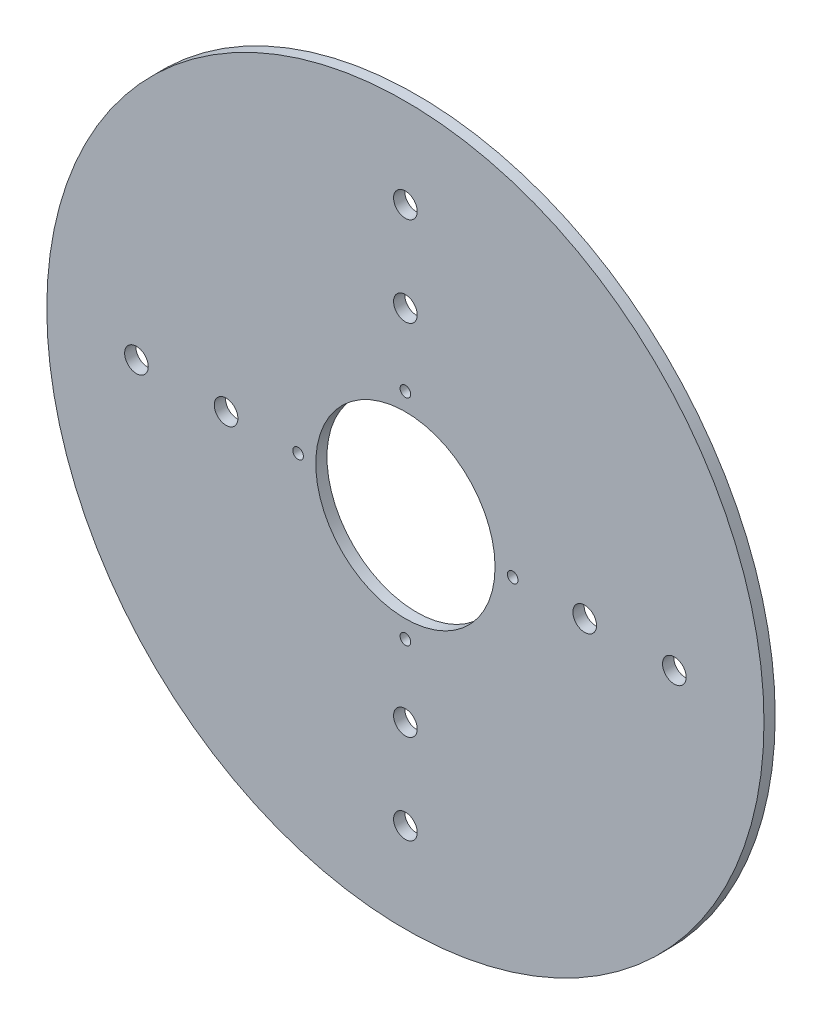
ISO-10303-21;
HEADER;
FILE_DESCRIPTION(('STEP AP214'),'2;1');
FILE_NAME('part.step','',(''),(''),'','','');
FILE_SCHEMA(('AUTOMOTIVE_DESIGN { 1 0 10303 214 1 1 1 1 }'));
ENDSEC;
DATA;
#1=APPLICATION_CONTEXT('core data for automotive mechanical design processes');
#2=APPLICATION_PROTOCOL_DEFINITION('international standard','automotive_design',2000,#1);
#3=PRODUCT_CONTEXT('',#1,'mechanical');
#4=PRODUCT('Part','Part','',(#3));
#5=PRODUCT_RELATED_PRODUCT_CATEGORY('part','',(#4));
#6=PRODUCT_DEFINITION_FORMATION('','',#4);
#7=PRODUCT_DEFINITION_CONTEXT('part definition',#1,'design');
#8=PRODUCT_DEFINITION('design','',#6,#7);
#9=PRODUCT_DEFINITION_SHAPE('','',#8);
#10=(LENGTH_UNIT() NAMED_UNIT(*) SI_UNIT(.MILLI.,.METRE.));
#11=(NAMED_UNIT(*) PLANE_ANGLE_UNIT() SI_UNIT($,.RADIAN.));
#12=(NAMED_UNIT(*) SI_UNIT($,.STERADIAN.) SOLID_ANGLE_UNIT());
#13=UNCERTAINTY_MEASURE_WITH_UNIT(LENGTH_MEASURE(1.E-05),#10,'distance_accuracy_value','');
#14=(GEOMETRIC_REPRESENTATION_CONTEXT(3) GLOBAL_UNCERTAINTY_ASSIGNED_CONTEXT((#13)) GLOBAL_UNIT_ASSIGNED_CONTEXT((#10,
#11,#12)) REPRESENTATION_CONTEXT('',''));
#15=CARTESIAN_POINT('',(0.,0.,0.));
#16=DIRECTION('',(0.,0.,1.));
#17=DIRECTION('',(1.,0.,0.));
#18=AXIS2_PLACEMENT_3D('',#15,#16,#17);
#19=CARTESIAN_POINT('',(0.,0.,3.175));
#20=DIRECTION('',(0.,0.,-1.));
#21=DIRECTION('',(-1.,0.,0.));
#22=AXIS2_PLACEMENT_3D('',#19,#20,#21);
#23=CYLINDRICAL_SURFACE('',#22,101.6);
#24=CARTESIAN_POINT('',(0.,0.,3.175));
#25=DIRECTION('',(0.,0.,1.));
#26=DIRECTION('',(1.,0.,0.));
#27=AXIS2_PLACEMENT_3D('',#24,#25,#26);
#28=CIRCLE('',#27,101.6);
#29=CARTESIAN_POINT('',(101.6,0.,3.175));
#30=VERTEX_POINT('',#29);
#31=EDGE_CURVE('E10',#30,#30,#28,.T.);
#32=ORIENTED_EDGE('',*,*,#31,.F.);
#33=EDGE_LOOP('',(#32));
#34=FACE_BOUND('',#33,.T.);
#35=CARTESIAN_POINT('',(0.,0.,0.));
#36=DIRECTION('',(0.,0.,1.));
#37=DIRECTION('',(1.,0.,0.));
#38=AXIS2_PLACEMENT_3D('',#35,#36,#37);
#39=CIRCLE('',#38,101.6);
#40=CARTESIAN_POINT('',(101.6,0.,0.));
#41=VERTEX_POINT('',#40);
#42=EDGE_CURVE('E34',#41,#41,#39,.T.);
#43=ORIENTED_EDGE('',*,*,#42,.T.);
#44=EDGE_LOOP('',(#43));
#45=FACE_BOUND('',#44,.T.);
#46=ADVANCED_FACE('F31',(#34,#45),#23,.T.);
#47=CARTESIAN_POINT('',(0.,0.,3.175));
#48=DIRECTION('',(0.,0.,1.));
#49=DIRECTION('',(1.,0.,0.));
#50=AXIS2_PLACEMENT_3D('',#47,#48,#49);
#51=PLANE('',#50);
#52=CARTESIAN_POINT('',(76.2,0.,3.175));
#53=DIRECTION('',(0.,0.,1.));
#54=DIRECTION('',(1.,0.,0.));
#55=AXIS2_PLACEMENT_3D('',#52,#53,#54);
#56=CIRCLE('',#55,3.35);
#57=CARTESIAN_POINT('',(79.55,0.,3.175));
#58=VERTEX_POINT('',#57);
#59=EDGE_CURVE('E89',#58,#58,#56,.T.);
#60=ORIENTED_EDGE('',*,*,#59,.F.);
#61=EDGE_LOOP('',(#60));
#62=FACE_BOUND('',#61,.T.);
#63=CARTESIAN_POINT('',(0.,76.2,3.175));
#64=DIRECTION('',(0.,0.,1.));
#65=DIRECTION('',(1.,0.,0.));
#66=AXIS2_PLACEMENT_3D('',#63,#64,#65);
#67=CIRCLE('',#66,3.35);
#68=CARTESIAN_POINT('',(3.35,76.2,3.175));
#69=VERTEX_POINT('',#68);
#70=EDGE_CURVE('E99',#69,#69,#67,.T.);
#71=ORIENTED_EDGE('',*,*,#70,.F.);
#72=EDGE_LOOP('',(#71));
#73=FACE_BOUND('',#72,.T.);
#74=CARTESIAN_POINT('',(-76.2,0.,3.175));
#75=DIRECTION('',(0.,0.,1.));
#76=DIRECTION('',(1.,0.,0.));
#77=AXIS2_PLACEMENT_3D('',#74,#75,#76);
#78=CIRCLE('',#77,3.35);
#79=CARTESIAN_POINT('',(-72.85,0.,3.175));
#80=VERTEX_POINT('',#79);
#81=EDGE_CURVE('E102',#80,#80,#78,.T.);
#82=ORIENTED_EDGE('',*,*,#81,.F.);
#83=EDGE_LOOP('',(#82));
#84=FACE_BOUND('',#83,.T.);
#85=CARTESIAN_POINT('',(0.,-76.2,3.175));
#86=DIRECTION('',(0.,0.,1.));
#87=DIRECTION('',(1.,0.,0.));
#88=AXIS2_PLACEMENT_3D('',#85,#86,#87);
#89=CIRCLE('',#88,3.35);
#90=CARTESIAN_POINT('',(3.35,-76.2,3.175));
#91=VERTEX_POINT('',#90);
#92=EDGE_CURVE('E105',#91,#91,#89,.T.);
#93=ORIENTED_EDGE('',*,*,#92,.F.);
#94=EDGE_LOOP('',(#93));
#95=FACE_BOUND('',#94,.T.);
#96=CARTESIAN_POINT('',(0.,50.8,3.175));
#97=DIRECTION('',(0.,0.,1.));
#98=DIRECTION('',(1.,0.,0.));
#99=AXIS2_PLACEMENT_3D('',#96,#97,#98);
#100=CIRCLE('',#99,3.35);
#101=CARTESIAN_POINT('',(3.35,50.8,3.175));
#102=VERTEX_POINT('',#101);
#103=EDGE_CURVE('E65',#102,#102,#100,.T.);
#104=ORIENTED_EDGE('',*,*,#103,.F.);
#105=EDGE_LOOP('',(#104));
#106=FACE_BOUND('',#105,.T.);
#107=CARTESIAN_POINT('',(50.8,0.,3.175));
#108=DIRECTION('',(0.,0.,1.));
#109=DIRECTION('',(1.,0.,0.));
#110=AXIS2_PLACEMENT_3D('',#107,#108,#109);
#111=CIRCLE('',#110,3.35);
#112=CARTESIAN_POINT('',(54.15,0.,3.175));
#113=VERTEX_POINT('',#112);
#114=EDGE_CURVE('E75',#113,#113,#111,.T.);
#115=ORIENTED_EDGE('',*,*,#114,.F.);
#116=EDGE_LOOP('',(#115));
#117=FACE_BOUND('',#116,.T.);
#118=CARTESIAN_POINT('',(0.,-50.8,3.175));
#119=DIRECTION('',(0.,0.,1.));
#120=DIRECTION('',(1.,0.,0.));
#121=AXIS2_PLACEMENT_3D('',#118,#119,#120);
#122=CIRCLE('',#121,3.35);
#123=CARTESIAN_POINT('',(3.35,-50.8,3.175));
#124=VERTEX_POINT('',#123);
#125=EDGE_CURVE('E78',#124,#124,#122,.T.);
#126=ORIENTED_EDGE('',*,*,#125,.F.);
#127=EDGE_LOOP('',(#126));
#128=FACE_BOUND('',#127,.T.);
#129=CARTESIAN_POINT('',(-50.8,0.,3.175));
#130=DIRECTION('',(0.,0.,1.));
#131=DIRECTION('',(1.,0.,0.));
#132=AXIS2_PLACEMENT_3D('',#129,#130,#131);
#133=CIRCLE('',#132,3.35);
#134=CARTESIAN_POINT('',(-47.45,0.,3.175));
#135=VERTEX_POINT('',#134);
#136=EDGE_CURVE('E81',#135,#135,#133,.T.);
#137=ORIENTED_EDGE('',*,*,#136,.F.);
#138=EDGE_LOOP('',(#137));
#139=FACE_BOUND('',#138,.T.);
#140=CARTESIAN_POINT('',(0.,30.399999906,3.175));
#141=DIRECTION('',(0.,0.,1.));
#142=DIRECTION('',(1.,0.,0.));
#143=AXIS2_PLACEMENT_3D('',#140,#141,#142);
#144=CIRCLE('',#143,1.5);
#145=CARTESIAN_POINT('',(1.5,30.399999906,3.175));
#146=VERTEX_POINT('',#145);
#147=EDGE_CURVE('E46',#146,#146,#144,.T.);
#148=ORIENTED_EDGE('',*,*,#147,.F.);
#149=EDGE_LOOP('',(#148));
#150=FACE_BOUND('',#149,.T.);
#151=CARTESIAN_POINT('',(-30.399999906,0.,3.175));
#152=DIRECTION('',(0.,0.,1.));
#153=DIRECTION('',(1.,0.,0.));
#154=AXIS2_PLACEMENT_3D('',#151,#152,#153);
#155=CIRCLE('',#154,1.5);
#156=CARTESIAN_POINT('',(-28.899999906,0.,3.175));
#157=VERTEX_POINT('',#156);
#158=EDGE_CURVE('E51',#157,#157,#155,.T.);
#159=ORIENTED_EDGE('',*,*,#158,.F.);
#160=EDGE_LOOP('',(#159));
#161=FACE_BOUND('',#160,.T.);
#162=CARTESIAN_POINT('',(0.,-30.399999906,3.175));
#163=DIRECTION('',(0.,0.,1.));
#164=DIRECTION('',(1.,0.,0.));
#165=AXIS2_PLACEMENT_3D('',#162,#163,#164);
#166=CIRCLE('',#165,1.5);
#167=CARTESIAN_POINT('',(1.5,-30.399999906,3.175));
#168=VERTEX_POINT('',#167);
#169=EDGE_CURVE('E54',#168,#168,#166,.T.);
#170=ORIENTED_EDGE('',*,*,#169,.F.);
#171=EDGE_LOOP('',(#170));
#172=FACE_BOUND('',#171,.T.);
#173=CARTESIAN_POINT('',(30.399999906,0.,3.175));
#174=DIRECTION('',(0.,0.,1.));
#175=DIRECTION('',(1.,0.,0.));
#176=AXIS2_PLACEMENT_3D('',#173,#174,#175);
#177=CIRCLE('',#176,1.5);
#178=CARTESIAN_POINT('',(31.899999906,0.,3.175));
#179=VERTEX_POINT('',#178);
#180=EDGE_CURVE('E57',#179,#179,#177,.T.);
#181=ORIENTED_EDGE('',*,*,#180,.F.);
#182=EDGE_LOOP('',(#181));
#183=FACE_BOUND('',#182,.T.);
#184=CARTESIAN_POINT('',(0.,0.,3.175));
#185=DIRECTION('',(0.,0.,1.));
#186=DIRECTION('',(1.,0.,0.));
#187=AXIS2_PLACEMENT_3D('',#184,#185,#186);
#188=CIRCLE('',#187,25.4);
#189=CARTESIAN_POINT('',(25.4,0.,3.175));
#190=VERTEX_POINT('',#189);
#191=EDGE_CURVE('E43',#190,#190,#188,.T.);
#192=ORIENTED_EDGE('',*,*,#191,.F.);
#193=EDGE_LOOP('',(#192));
#194=FACE_BOUND('',#193,.T.);
#195=ORIENTED_EDGE('',*,*,#31,.T.);
#196=EDGE_LOOP('',(#195));
#197=FACE_BOUND('',#196,.T.);
#198=ADVANCED_FACE('F127',(#62,#73,#84,#95,#106,#117,#128,#139,#150,#161,#172,#183,#194,#197),
#51,.T.);
#199=CARTESIAN_POINT('',(0.,0.,0.));
#200=DIRECTION('',(0.,0.,1.));
#201=DIRECTION('',(1.,0.,0.));
#202=AXIS2_PLACEMENT_3D('',#199,#200,#201);
#203=PLANE('',#202);
#204=CARTESIAN_POINT('',(76.2,0.,0.));
#205=DIRECTION('',(0.,0.,-1.));
#206=DIRECTION('',(-1.,0.,0.));
#207=AXIS2_PLACEMENT_3D('',#204,#205,#206);
#208=CIRCLE('',#207,3.35);
#209=CARTESIAN_POINT('',(72.85,0.,0.));
#210=VERTEX_POINT('',#209);
#211=EDGE_CURVE('E108',#210,#210,#208,.T.);
#212=ORIENTED_EDGE('',*,*,#211,.F.);
#213=EDGE_LOOP('',(#212));
#214=FACE_BOUND('',#213,.T.);
#215=CARTESIAN_POINT('',(0.,76.2,0.));
#216=DIRECTION('',(0.,0.,-1.));
#217=DIRECTION('',(-1.,0.,0.));
#218=AXIS2_PLACEMENT_3D('',#215,#216,#217);
#219=CIRCLE('',#218,3.35);
#220=CARTESIAN_POINT('',(-3.35,76.2,0.));
#221=VERTEX_POINT('',#220);
#222=EDGE_CURVE('E115',#221,#221,#219,.T.);
#223=ORIENTED_EDGE('',*,*,#222,.F.);
#224=EDGE_LOOP('',(#223));
#225=FACE_BOUND('',#224,.T.);
#226=CARTESIAN_POINT('',(-76.2,0.,0.));
#227=DIRECTION('',(0.,0.,-1.));
#228=DIRECTION('',(-1.,0.,0.));
#229=AXIS2_PLACEMENT_3D('',#226,#227,#228);
#230=CIRCLE('',#229,3.35);
#231=CARTESIAN_POINT('',(-79.55,0.,0.));
#232=VERTEX_POINT('',#231);
#233=EDGE_CURVE('E112',#232,#232,#230,.T.);
#234=ORIENTED_EDGE('',*,*,#233,.F.);
#235=EDGE_LOOP('',(#234));
#236=FACE_BOUND('',#235,.T.);
#237=CARTESIAN_POINT('',(0.,-76.2,0.));
#238=DIRECTION('',(0.,0.,-1.));
#239=DIRECTION('',(-1.,0.,0.));
#240=AXIS2_PLACEMENT_3D('',#237,#238,#239);
#241=CIRCLE('',#240,3.35);
#242=CARTESIAN_POINT('',(-3.35,-76.2,0.));
#243=VERTEX_POINT('',#242);
#244=EDGE_CURVE('E109',#243,#243,#241,.T.);
#245=ORIENTED_EDGE('',*,*,#244,.F.);
#246=EDGE_LOOP('',(#245));
#247=FACE_BOUND('',#246,.T.);
#248=CARTESIAN_POINT('',(0.,50.8,0.));
#249=DIRECTION('',(0.,0.,-1.));
#250=DIRECTION('',(-1.,0.,0.));
#251=AXIS2_PLACEMENT_3D('',#248,#249,#250);
#252=CIRCLE('',#251,3.35);
#253=CARTESIAN_POINT('',(-3.35,50.8,0.));
#254=VERTEX_POINT('',#253);
#255=EDGE_CURVE('E84',#254,#254,#252,.T.);
#256=ORIENTED_EDGE('',*,*,#255,.F.);
#257=EDGE_LOOP('',(#256));
#258=FACE_BOUND('',#257,.T.);
#259=CARTESIAN_POINT('',(50.8,0.,0.));
#260=DIRECTION('',(0.,0.,-1.));
#261=DIRECTION('',(-1.,0.,0.));
#262=AXIS2_PLACEMENT_3D('',#259,#260,#261);
#263=CIRCLE('',#262,3.35);
#264=CARTESIAN_POINT('',(47.45,0.,0.));
#265=VERTEX_POINT('',#264);
#266=EDGE_CURVE('E92',#265,#265,#263,.T.);
#267=ORIENTED_EDGE('',*,*,#266,.F.);
#268=EDGE_LOOP('',(#267));
#269=FACE_BOUND('',#268,.T.);
#270=CARTESIAN_POINT('',(0.,-50.8,0.));
#271=DIRECTION('',(0.,0.,-1.));
#272=DIRECTION('',(-1.,0.,0.));
#273=AXIS2_PLACEMENT_3D('',#270,#271,#272);
#274=CIRCLE('',#273,3.35);
#275=CARTESIAN_POINT('',(-3.35,-50.8,0.));
#276=VERTEX_POINT('',#275);
#277=EDGE_CURVE('E88',#276,#276,#274,.T.);
#278=ORIENTED_EDGE('',*,*,#277,.F.);
#279=EDGE_LOOP('',(#278));
#280=FACE_BOUND('',#279,.T.);
#281=CARTESIAN_POINT('',(-50.8,0.,0.));
#282=DIRECTION('',(0.,0.,-1.));
#283=DIRECTION('',(-1.,0.,0.));
#284=AXIS2_PLACEMENT_3D('',#281,#282,#283);
#285=CIRCLE('',#284,3.35);
#286=CARTESIAN_POINT('',(-54.15,0.,0.));
#287=VERTEX_POINT('',#286);
#288=EDGE_CURVE('E85',#287,#287,#285,.T.);
#289=ORIENTED_EDGE('',*,*,#288,.F.);
#290=EDGE_LOOP('',(#289));
#291=FACE_BOUND('',#290,.T.);
#292=CARTESIAN_POINT('',(0.,30.399999906,0.));
#293=DIRECTION('',(0.,0.,-1.));
#294=DIRECTION('',(-1.,0.,0.));
#295=AXIS2_PLACEMENT_3D('',#292,#293,#294);
#296=CIRCLE('',#295,1.5);
#297=CARTESIAN_POINT('',(-1.5,30.399999906,0.));
#298=VERTEX_POINT('',#297);
#299=EDGE_CURVE('E60',#298,#298,#296,.T.);
#300=ORIENTED_EDGE('',*,*,#299,.F.);
#301=EDGE_LOOP('',(#300));
#302=FACE_BOUND('',#301,.T.);
#303=CARTESIAN_POINT('',(-30.399999906,0.,0.));
#304=DIRECTION('',(0.,0.,-1.));
#305=DIRECTION('',(-1.,0.,0.));
#306=AXIS2_PLACEMENT_3D('',#303,#304,#305);
#307=CIRCLE('',#306,1.5);
#308=CARTESIAN_POINT('',(-31.899999906,0.,0.));
#309=VERTEX_POINT('',#308);
#310=EDGE_CURVE('E68',#309,#309,#307,.T.);
#311=ORIENTED_EDGE('',*,*,#310,.F.);
#312=EDGE_LOOP('',(#311));
#313=FACE_BOUND('',#312,.T.);
#314=CARTESIAN_POINT('',(0.,-30.399999906,0.));
#315=DIRECTION('',(0.,0.,-1.));
#316=DIRECTION('',(-1.,0.,0.));
#317=AXIS2_PLACEMENT_3D('',#314,#315,#316);
#318=CIRCLE('',#317,1.5);
#319=CARTESIAN_POINT('',(-1.5,-30.399999906,0.));
#320=VERTEX_POINT('',#319);
#321=EDGE_CURVE('E64',#320,#320,#318,.T.);
#322=ORIENTED_EDGE('',*,*,#321,.F.);
#323=EDGE_LOOP('',(#322));
#324=FACE_BOUND('',#323,.T.);
#325=CARTESIAN_POINT('',(30.399999906,0.,0.));
#326=DIRECTION('',(0.,0.,-1.));
#327=DIRECTION('',(-1.,0.,0.));
#328=AXIS2_PLACEMENT_3D('',#325,#326,#327);
#329=CIRCLE('',#328,1.5);
#330=CARTESIAN_POINT('',(28.899999906,0.,0.));
#331=VERTEX_POINT('',#330);
#332=EDGE_CURVE('E61',#331,#331,#329,.T.);
#333=ORIENTED_EDGE('',*,*,#332,.F.);
#334=EDGE_LOOP('',(#333));
#335=FACE_BOUND('',#334,.T.);
#336=CARTESIAN_POINT('',(0.,0.,0.));
#337=DIRECTION('',(0.,0.,1.));
#338=DIRECTION('',(1.,0.,0.));
#339=AXIS2_PLACEMENT_3D('',#336,#337,#338);
#340=CIRCLE('',#339,25.4);
#341=CARTESIAN_POINT('',(25.4,0.,0.));
#342=VERTEX_POINT('',#341);
#343=EDGE_CURVE('E41',#342,#342,#340,.T.);
#344=ORIENTED_EDGE('',*,*,#343,.T.);
#345=EDGE_LOOP('',(#344));
#346=FACE_BOUND('',#345,.T.);
#347=ORIENTED_EDGE('',*,*,#42,.F.);
#348=EDGE_LOOP('',(#347));
#349=FACE_BOUND('',#348,.T.);
#350=ADVANCED_FACE('F123',(#214,#225,#236,#247,#258,#269,#280,#291,#302,#313,#324,#335,#346,
#349),#203,.F.);
#351=CARTESIAN_POINT('',(0.,0.,0.));
#352=DIRECTION('',(0.,0.,1.));
#353=DIRECTION('',(1.,0.,0.));
#354=AXIS2_PLACEMENT_3D('',#351,#352,#353);
#355=CYLINDRICAL_SURFACE('',#354,25.4);
#356=ORIENTED_EDGE('',*,*,#343,.F.);
#357=EDGE_LOOP('',(#356));
#358=FACE_BOUND('',#357,.T.);
#359=ORIENTED_EDGE('',*,*,#191,.T.);
#360=EDGE_LOOP('',(#359));
#361=FACE_BOUND('',#360,.T.);
#362=ADVANCED_FACE('F126',(#358,#361),#355,.F.);
#363=CARTESIAN_POINT('',(30.399999906,0.,10.));
#364=DIRECTION('',(0.,0.,-1.));
#365=DIRECTION('',(-1.,0.,0.));
#366=AXIS2_PLACEMENT_3D('',#363,#364,#365);
#367=CYLINDRICAL_SURFACE('',#366,1.5);
#368=ORIENTED_EDGE('',*,*,#180,.T.);
#369=EDGE_LOOP('',(#368));
#370=FACE_BOUND('',#369,.T.);
#371=ORIENTED_EDGE('',*,*,#332,.T.);
#372=EDGE_LOOP('',(#371));
#373=FACE_BOUND('',#372,.T.);
#374=ADVANCED_FACE('F168',(#370,#373),#367,.F.);
#375=CARTESIAN_POINT('',(0.,-30.399999906,10.));
#376=DIRECTION('',(0.,0.,-1.));
#377=DIRECTION('',(-1.,0.,0.));
#378=AXIS2_PLACEMENT_3D('',#375,#376,#377);
#379=CYLINDRICAL_SURFACE('',#378,1.5);
#380=ORIENTED_EDGE('',*,*,#169,.T.);
#381=EDGE_LOOP('',(#380));
#382=FACE_BOUND('',#381,.T.);
#383=ORIENTED_EDGE('',*,*,#321,.T.);
#384=EDGE_LOOP('',(#383));
#385=FACE_BOUND('',#384,.T.);
#386=ADVANCED_FACE('F172',(#382,#385),#379,.F.);
#387=CARTESIAN_POINT('',(-30.399999906,0.,10.));
#388=DIRECTION('',(0.,0.,-1.));
#389=DIRECTION('',(-1.,0.,0.));
#390=AXIS2_PLACEMENT_3D('',#387,#388,#389);
#391=CYLINDRICAL_SURFACE('',#390,1.5);
#392=ORIENTED_EDGE('',*,*,#158,.T.);
#393=EDGE_LOOP('',(#392));
#394=FACE_BOUND('',#393,.T.);
#395=ORIENTED_EDGE('',*,*,#310,.T.);
#396=EDGE_LOOP('',(#395));
#397=FACE_BOUND('',#396,.T.);
#398=ADVANCED_FACE('F176',(#394,#397),#391,.F.);
#399=CARTESIAN_POINT('',(0.,30.399999906,10.));
#400=DIRECTION('',(0.,0.,-1.));
#401=DIRECTION('',(-1.,0.,0.));
#402=AXIS2_PLACEMENT_3D('',#399,#400,#401);
#403=CYLINDRICAL_SURFACE('',#402,1.5);
#404=ORIENTED_EDGE('',*,*,#147,.T.);
#405=EDGE_LOOP('',(#404));
#406=FACE_BOUND('',#405,.T.);
#407=ORIENTED_EDGE('',*,*,#299,.T.);
#408=EDGE_LOOP('',(#407));
#409=FACE_BOUND('',#408,.T.);
#410=ADVANCED_FACE('F180',(#406,#409),#403,.F.);
#411=CARTESIAN_POINT('',(-50.8,0.,10.));
#412=DIRECTION('',(0.,0.,-1.));
#413=DIRECTION('',(-1.,0.,0.));
#414=AXIS2_PLACEMENT_3D('',#411,#412,#413);
#415=CYLINDRICAL_SURFACE('',#414,3.35);
#416=ORIENTED_EDGE('',*,*,#136,.T.);
#417=EDGE_LOOP('',(#416));
#418=FACE_BOUND('',#417,.T.);
#419=ORIENTED_EDGE('',*,*,#288,.T.);
#420=EDGE_LOOP('',(#419));
#421=FACE_BOUND('',#420,.T.);
#422=ADVANCED_FACE('F184',(#418,#421),#415,.F.);
#423=CARTESIAN_POINT('',(0.,-50.8,10.));
#424=DIRECTION('',(0.,0.,-1.));
#425=DIRECTION('',(-1.,0.,0.));
#426=AXIS2_PLACEMENT_3D('',#423,#424,#425);
#427=CYLINDRICAL_SURFACE('',#426,3.35);
#428=ORIENTED_EDGE('',*,*,#125,.T.);
#429=EDGE_LOOP('',(#428));
#430=FACE_BOUND('',#429,.T.);
#431=ORIENTED_EDGE('',*,*,#277,.T.);
#432=EDGE_LOOP('',(#431));
#433=FACE_BOUND('',#432,.T.);
#434=ADVANCED_FACE('F188',(#430,#433),#427,.F.);
#435=CARTESIAN_POINT('',(50.8,0.,10.));
#436=DIRECTION('',(0.,0.,-1.));
#437=DIRECTION('',(-1.,0.,0.));
#438=AXIS2_PLACEMENT_3D('',#435,#436,#437);
#439=CYLINDRICAL_SURFACE('',#438,3.35);
#440=ORIENTED_EDGE('',*,*,#114,.T.);
#441=EDGE_LOOP('',(#440));
#442=FACE_BOUND('',#441,.T.);
#443=ORIENTED_EDGE('',*,*,#266,.T.);
#444=EDGE_LOOP('',(#443));
#445=FACE_BOUND('',#444,.T.);
#446=ADVANCED_FACE('F192',(#442,#445),#439,.F.);
#447=CARTESIAN_POINT('',(0.,50.8,10.));
#448=DIRECTION('',(0.,0.,-1.));
#449=DIRECTION('',(-1.,0.,0.));
#450=AXIS2_PLACEMENT_3D('',#447,#448,#449);
#451=CYLINDRICAL_SURFACE('',#450,3.35);
#452=ORIENTED_EDGE('',*,*,#103,.T.);
#453=EDGE_LOOP('',(#452));
#454=FACE_BOUND('',#453,.T.);
#455=ORIENTED_EDGE('',*,*,#255,.T.);
#456=EDGE_LOOP('',(#455));
#457=FACE_BOUND('',#456,.T.);
#458=ADVANCED_FACE('F196',(#454,#457),#451,.F.);
#459=CARTESIAN_POINT('',(0.,-76.2,10.));
#460=DIRECTION('',(0.,0.,-1.));
#461=DIRECTION('',(-1.,0.,0.));
#462=AXIS2_PLACEMENT_3D('',#459,#460,#461);
#463=CYLINDRICAL_SURFACE('',#462,3.35);
#464=ORIENTED_EDGE('',*,*,#92,.T.);
#465=EDGE_LOOP('',(#464));
#466=FACE_BOUND('',#465,.T.);
#467=ORIENTED_EDGE('',*,*,#244,.T.);
#468=EDGE_LOOP('',(#467));
#469=FACE_BOUND('',#468,.T.);
#470=ADVANCED_FACE('F200',(#466,#469),#463,.F.);
#471=CARTESIAN_POINT('',(-76.2,0.,10.));
#472=DIRECTION('',(0.,0.,-1.));
#473=DIRECTION('',(-1.,0.,0.));
#474=AXIS2_PLACEMENT_3D('',#471,#472,#473);
#475=CYLINDRICAL_SURFACE('',#474,3.35);
#476=ORIENTED_EDGE('',*,*,#81,.T.);
#477=EDGE_LOOP('',(#476));
#478=FACE_BOUND('',#477,.T.);
#479=ORIENTED_EDGE('',*,*,#233,.T.);
#480=EDGE_LOOP('',(#479));
#481=FACE_BOUND('',#480,.T.);
#482=ADVANCED_FACE('F204',(#478,#481),#475,.F.);
#483=CARTESIAN_POINT('',(0.,76.2,10.));
#484=DIRECTION('',(0.,0.,-1.));
#485=DIRECTION('',(-1.,0.,0.));
#486=AXIS2_PLACEMENT_3D('',#483,#484,#485);
#487=CYLINDRICAL_SURFACE('',#486,3.35);
#488=ORIENTED_EDGE('',*,*,#70,.T.);
#489=EDGE_LOOP('',(#488));
#490=FACE_BOUND('',#489,.T.);
#491=ORIENTED_EDGE('',*,*,#222,.T.);
#492=EDGE_LOOP('',(#491));
#493=FACE_BOUND('',#492,.T.);
#494=ADVANCED_FACE('F208',(#490,#493),#487,.F.);
#495=CARTESIAN_POINT('',(76.2,0.,10.));
#496=DIRECTION('',(0.,0.,-1.));
#497=DIRECTION('',(-1.,0.,0.));
#498=AXIS2_PLACEMENT_3D('',#495,#496,#497);
#499=CYLINDRICAL_SURFACE('',#498,3.35);
#500=ORIENTED_EDGE('',*,*,#59,.T.);
#501=EDGE_LOOP('',(#500));
#502=FACE_BOUND('',#501,.T.);
#503=ORIENTED_EDGE('',*,*,#211,.T.);
#504=EDGE_LOOP('',(#503));
#505=FACE_BOUND('',#504,.T.);
#506=ADVANCED_FACE('F121',(#502,#505),#499,.F.);
#507=CLOSED_SHELL('',(#46,#198,#350,#362,#374,#386,#398,#410,#422,#434,#446,#458,#470,#482,#494,#506));
#508=MANIFOLD_SOLID_BREP('B2',#507);
#509=ADVANCED_BREP_SHAPE_REPRESENTATION('',(#18,#508),#14);
#510=SHAPE_DEFINITION_REPRESENTATION(#9,#509);
ENDSEC;
END-ISO-10303-21;
